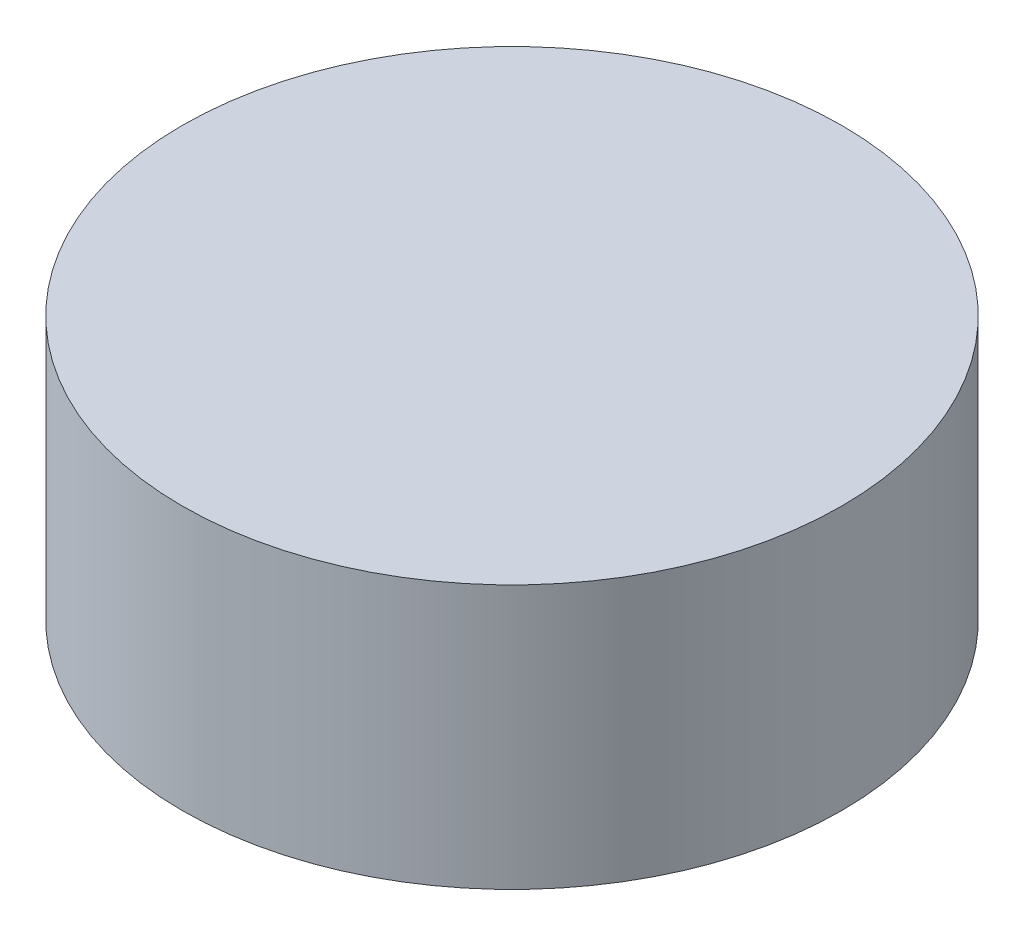
ISO-10303-21;
HEADER;
FILE_DESCRIPTION(('STEP AP214'),'2;1');
FILE_NAME('part.step','',(''),(''),'','','');
FILE_SCHEMA(('AUTOMOTIVE_DESIGN { 1 0 10303 214 1 1 1 1 }'));
ENDSEC;
DATA;
#1=APPLICATION_CONTEXT('core data for automotive mechanical design processes');
#2=APPLICATION_PROTOCOL_DEFINITION('international standard','automotive_design',2000,#1);
#3=PRODUCT_CONTEXT('',#1,'mechanical');
#4=PRODUCT('Part','Part','',(#3));
#5=PRODUCT_RELATED_PRODUCT_CATEGORY('part','',(#4));
#6=PRODUCT_DEFINITION_FORMATION('','',#4);
#7=PRODUCT_DEFINITION_CONTEXT('part definition',#1,'design');
#8=PRODUCT_DEFINITION('design','',#6,#7);
#9=PRODUCT_DEFINITION_SHAPE('','',#8);
#10=(LENGTH_UNIT() NAMED_UNIT(*) SI_UNIT(.MILLI.,.METRE.));
#11=(NAMED_UNIT(*) PLANE_ANGLE_UNIT() SI_UNIT($,.RADIAN.));
#12=(NAMED_UNIT(*) SI_UNIT($,.STERADIAN.) SOLID_ANGLE_UNIT());
#13=UNCERTAINTY_MEASURE_WITH_UNIT(LENGTH_MEASURE(1.E-05),#10,'distance_accuracy_value','');
#14=(GEOMETRIC_REPRESENTATION_CONTEXT(3) GLOBAL_UNCERTAINTY_ASSIGNED_CONTEXT((#13)) GLOBAL_UNIT_ASSIGNED_CONTEXT((#10,
#11,#12)) REPRESENTATION_CONTEXT('',''));
#15=CARTESIAN_POINT('',(0.,0.,0.));
#16=DIRECTION('',(0.,0.,1.));
#17=DIRECTION('',(1.,0.,0.));
#18=AXIS2_PLACEMENT_3D('',#15,#16,#17);
#19=CARTESIAN_POINT('',(0.,2.,0.));
#20=DIRECTION('',(0.,-1.,0.));
#21=DIRECTION('',(0.,0.,-1.));
#22=AXIS2_PLACEMENT_3D('',#19,#20,#21);
#23=CYLINDRICAL_SURFACE('',#22,2.5);
#24=CARTESIAN_POINT('',(0.,2.,0.));
#25=DIRECTION('',(0.,1.,0.));
#26=DIRECTION('',(0.,0.,1.));
#27=AXIS2_PLACEMENT_3D('',#24,#25,#26);
#28=CIRCLE('',#27,2.5);
#29=CARTESIAN_POINT('',(0.,2.,2.5));
#30=VERTEX_POINT('',#29);
#31=EDGE_CURVE('E10',#30,#30,#28,.T.);
#32=ORIENTED_EDGE('',*,*,#31,.F.);
#33=EDGE_LOOP('',(#32));
#34=FACE_BOUND('',#33,.T.);
#35=CARTESIAN_POINT('',(0.,0.,0.));
#36=DIRECTION('',(0.,1.,0.));
#37=DIRECTION('',(0.,0.,1.));
#38=AXIS2_PLACEMENT_3D('',#35,#36,#37);
#39=CIRCLE('',#38,2.5);
#40=CARTESIAN_POINT('',(0.,0.,2.5));
#41=VERTEX_POINT('',#40);
#42=EDGE_CURVE('E40',#41,#41,#39,.T.);
#43=ORIENTED_EDGE('',*,*,#42,.T.);
#44=EDGE_LOOP('',(#43));
#45=FACE_BOUND('',#44,.T.);
#46=ADVANCED_FACE('F37',(#34,#45),#23,.T.);
#47=CARTESIAN_POINT('',(0.,2.,0.));
#48=DIRECTION('',(0.,1.,0.));
#49=DIRECTION('',(0.,0.,1.));
#50=AXIS2_PLACEMENT_3D('',#47,#48,#49);
#51=PLANE('',#50);
#52=ORIENTED_EDGE('',*,*,#31,.T.);
#53=EDGE_LOOP('',(#52));
#54=FACE_BOUND('',#53,.T.);
#55=ADVANCED_FACE('F52',(#54),#51,.T.);
#56=CARTESIAN_POINT('',(0.,0.,0.));
#57=DIRECTION('',(0.,1.,0.));
#58=DIRECTION('',(0.,0.,1.));
#59=AXIS2_PLACEMENT_3D('',#56,#57,#58);
#60=PLANE('',#59);
#61=ORIENTED_EDGE('',*,*,#42,.F.);
#62=EDGE_LOOP('',(#61));
#63=FACE_BOUND('',#62,.T.);
#64=ADVANCED_FACE('F50',(#63),#60,.F.);
#65=CLOSED_SHELL('',(#46,#55,#64));
#66=MANIFOLD_SOLID_BREP('B2',#65);
#67=ADVANCED_BREP_SHAPE_REPRESENTATION('',(#18,#66),#14);
#68=SHAPE_DEFINITION_REPRESENTATION(#9,#67);
ENDSEC;
END-ISO-10303-21;
